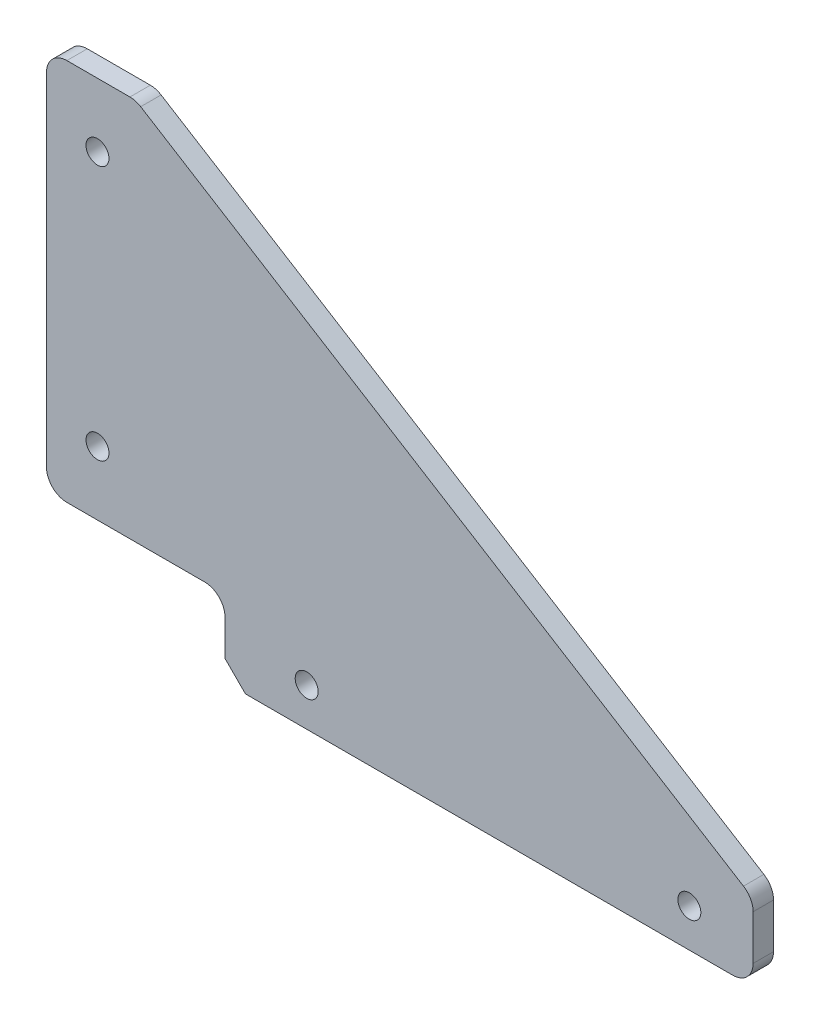
ISO-10303-21;
HEADER;
FILE_DESCRIPTION(('STEP AP214'),'2;1');
FILE_NAME('part.step','',(''),(''),'','','');
FILE_SCHEMA(('AUTOMOTIVE_DESIGN { 1 0 10303 214 1 1 1 1 }'));
ENDSEC;
DATA;
#1=APPLICATION_CONTEXT('core data for automotive mechanical design processes');
#2=APPLICATION_PROTOCOL_DEFINITION('international standard','automotive_design',2000,#1);
#3=PRODUCT_CONTEXT('',#1,'mechanical');
#4=PRODUCT('Part','Part','',(#3));
#5=PRODUCT_RELATED_PRODUCT_CATEGORY('part','',(#4));
#6=PRODUCT_DEFINITION_FORMATION('','',#4);
#7=PRODUCT_DEFINITION_CONTEXT('part definition',#1,'design');
#8=PRODUCT_DEFINITION('design','',#6,#7);
#9=PRODUCT_DEFINITION_SHAPE('','',#8);
#10=(LENGTH_UNIT() NAMED_UNIT(*) SI_UNIT(.MILLI.,.METRE.));
#11=(NAMED_UNIT(*) PLANE_ANGLE_UNIT() SI_UNIT($,.RADIAN.));
#12=(NAMED_UNIT(*) SI_UNIT($,.STERADIAN.) SOLID_ANGLE_UNIT());
#13=UNCERTAINTY_MEASURE_WITH_UNIT(LENGTH_MEASURE(1.E-05),#10,'distance_accuracy_value','');
#14=(GEOMETRIC_REPRESENTATION_CONTEXT(3) GLOBAL_UNCERTAINTY_ASSIGNED_CONTEXT((#13)) GLOBAL_UNIT_ASSIGNED_CONTEXT((#10,
#11,#12)) REPRESENTATION_CONTEXT('',''));
#15=CARTESIAN_POINT('',(0.,0.,0.));
#16=DIRECTION('',(0.,0.,1.));
#17=DIRECTION('',(1.,0.,0.));
#18=AXIS2_PLACEMENT_3D('',#15,#16,#17);
#19=CARTESIAN_POINT('',(-86.6689221257626,123.251708428246,8.));
#20=DIRECTION('',(0.,0.,-1.));
#21=DIRECTION('',(-1.,0.,0.));
#22=AXIS2_PLACEMENT_3D('',#19,#20,#21);
#23=PLANE('',#22);
#24=CARTESIAN_POINT('',(-86.6689221257626,123.251708428246,8.));
#25=DIRECTION('',(0.,0.,1.));
#26=DIRECTION('',(-1.,0.,0.));
#27=AXIS2_PLACEMENT_3D('',#24,#25,#26);
#28=CIRCLE('',#27,8.);
#29=CARTESIAN_POINT('',(-82.4542166522612,130.051433258828,8.));
#30=VERTEX_POINT('',#29);
#31=CARTESIAN_POINT('',(-86.6689221257626,131.251708428246,8.));
#32=VERTEX_POINT('',#31);
#33=EDGE_CURVE('E194',#30,#32,#28,.T.);
#34=ORIENTED_EDGE('',*,*,#33,.T.);
#35=DIRECTION('',(-1.,0.,0.));
#36=VECTOR('',#35,1.);
#37=CARTESIAN_POINT('',(-86.6689221257626,131.251708428246,8.));
#38=LINE('',#37,#36);
#39=CARTESIAN_POINT('',(-111.390660592255,131.251708428246,8.));
#40=VERTEX_POINT('',#39);
#41=EDGE_CURVE('E112',#32,#40,#38,.T.);
#42=ORIENTED_EDGE('',*,*,#41,.T.);
#43=CARTESIAN_POINT('',(-111.390660592255,123.251708428246,8.));
#44=DIRECTION('',(0.,0.,1.));
#45=DIRECTION('',(-1.,0.,0.));
#46=AXIS2_PLACEMENT_3D('',#43,#44,#45);
#47=CIRCLE('',#46,8.);
#48=CARTESIAN_POINT('',(-119.390660592255,123.251708428246,8.));
#49=VERTEX_POINT('',#48);
#50=EDGE_CURVE('E227',#40,#49,#47,.T.);
#51=ORIENTED_EDGE('',*,*,#50,.T.);
#52=DIRECTION('',(0.,-1.,0.));
#53=VECTOR('',#52,1.);
#54=CARTESIAN_POINT('',(-119.390660592255,123.251708428246,8.));
#55=LINE('',#54,#53);
#56=CARTESIAN_POINT('',(-119.390660592255,-10.748291571754,8.));
#57=VERTEX_POINT('',#56);
#58=EDGE_CURVE('E246',#49,#57,#55,.T.);
#59=ORIENTED_EDGE('',*,*,#58,.T.);
#60=CARTESIAN_POINT('',(-111.390660592255,-10.748291571754,8.));
#61=DIRECTION('',(0.,0.,1.));
#62=DIRECTION('',(-1.,0.,0.));
#63=AXIS2_PLACEMENT_3D('',#60,#61,#62);
#64=CIRCLE('',#63,8.00000000000001);
#65=CARTESIAN_POINT('',(-111.390660592255,-18.748291571754,8.));
#66=VERTEX_POINT('',#65);
#67=EDGE_CURVE('E243',#57,#66,#64,.T.);
#68=ORIENTED_EDGE('',*,*,#67,.T.);
#69=DIRECTION('',(1.,0.,0.));
#70=VECTOR('',#69,1.);
#71=CARTESIAN_POINT('',(-111.390660592255,-18.748291571754,8.));
#72=LINE('',#71,#70);
#73=CARTESIAN_POINT('',(-57.3906605922552,-18.748291571754,8.));
#74=VERTEX_POINT('',#73);
#75=EDGE_CURVE('E245',#66,#74,#72,.T.);
#76=ORIENTED_EDGE('',*,*,#75,.T.);
#77=CARTESIAN_POINT('',(-57.3906605922552,-26.748291571754,8.));
#78=DIRECTION('',(0.,0.,-1.));
#79=DIRECTION('',(1.,0.,0.));
#80=AXIS2_PLACEMENT_3D('',#77,#78,#79);
#81=CIRCLE('',#80,8.);
#82=CARTESIAN_POINT('',(-49.3906605922552,-26.748291571754,8.));
#83=VERTEX_POINT('',#82);
#84=EDGE_CURVE('E248',#74,#83,#81,.T.);
#85=ORIENTED_EDGE('',*,*,#84,.T.);
#86=DIRECTION('',(0.,-1.,0.));
#87=VECTOR('',#86,1.);
#88=CARTESIAN_POINT('',(-49.3906605922552,-26.748291571754,8.));
#89=LINE('',#88,#87);
#90=CARTESIAN_POINT('',(-49.3906605922552,-40.748291571754,8.));
#91=VERTEX_POINT('',#90);
#92=EDGE_CURVE('E254',#83,#91,#89,.T.);
#93=ORIENTED_EDGE('',*,*,#92,.T.);
#94=DIRECTION('',(0.70710678118655,-0.707106781186545,0.));
#95=VECTOR('',#94,1.);
#96=CARTESIAN_POINT('',(-41.3906605922551,-48.748291571754,8.));
#97=LINE('',#96,#95);
#98=CARTESIAN_POINT('',(-41.3906605922551,-48.748291571754,8.));
#99=VERTEX_POINT('',#98);
#100=EDGE_CURVE('E256',#91,#99,#97,.T.);
#101=ORIENTED_EDGE('',*,*,#100,.T.);
#102=DIRECTION('',(1.,0.,0.));
#103=VECTOR('',#102,1.);
#104=CARTESIAN_POINT('',(-41.3906605922551,-48.748291571754,8.));
#105=LINE('',#104,#103);
#106=CARTESIAN_POINT('',(149.609339407745,-48.748291571754,8.));
#107=VERTEX_POINT('',#106);
#108=EDGE_CURVE('E258',#99,#107,#105,.T.);
#109=ORIENTED_EDGE('',*,*,#108,.T.);
#110=CARTESIAN_POINT('',(149.609339407745,-40.748291571754,8.));
#111=DIRECTION('',(0.,0.,1.));
#112=DIRECTION('',(-1.,0.,0.));
#113=AXIS2_PLACEMENT_3D('',#110,#111,#112);
#114=CIRCLE('',#113,8.);
#115=CARTESIAN_POINT('',(157.609339407745,-40.7482915717539,8.));
#116=VERTEX_POINT('',#115);
#117=EDGE_CURVE('E149',#107,#116,#114,.T.);
#118=ORIENTED_EDGE('',*,*,#117,.T.);
#119=DIRECTION('',(0.,1.,0.));
#120=VECTOR('',#119,1.);
#121=CARTESIAN_POINT('',(157.609339407745,-40.7482915717539,8.));
#122=LINE('',#121,#120);
#123=CARTESIAN_POINT('',(157.609339407745,-23.2017594644239,8.));
#124=VERTEX_POINT('',#123);
#125=EDGE_CURVE('E143',#116,#124,#122,.T.);
#126=ORIENTED_EDGE('',*,*,#125,.T.);
#127=CARTESIAN_POINT('',(149.609339407745,-23.2017594644239,8.));
#128=DIRECTION('',(0.,0.,1.));
#129=DIRECTION('',(-1.,0.,0.));
#130=AXIS2_PLACEMENT_3D('',#127,#128,#129);
#131=CIRCLE('',#130,7.99999999999999);
#132=CARTESIAN_POINT('',(153.824044881246,-16.4020346338417,8.));
#133=VERTEX_POINT('',#132);
#134=EDGE_CURVE('E147',#124,#133,#131,.T.);
#135=ORIENTED_EDGE('',*,*,#134,.T.);
#136=DIRECTION('',(-0.849965603822785,0.526838184187677,0.));
#137=VECTOR('',#136,1.);
#138=CARTESIAN_POINT('',(153.824044881246,-16.4020346338417,8.));
#139=LINE('',#138,#137);
#140=EDGE_CURVE('E51',#133,#30,#139,.T.);
#141=ORIENTED_EDGE('',*,*,#140,.T.);
#142=EDGE_LOOP('',(#34,#42,#51,#59,#68,#76,#85,#93,#101,#109,#118,#126,#135,#141));
#143=FACE_BOUND('',#142,.T.);
#144=CARTESIAN_POINT('',(-99.3906605922552,106.251708428246,8.));
#145=DIRECTION('',(0.,0.,1.));
#146=DIRECTION('',(1.,0.,0.));
#147=AXIS2_PLACEMENT_3D('',#144,#145,#146);
#148=CIRCLE('',#147,4.50000000000001);
#149=CARTESIAN_POINT('',(-94.8906605922552,106.251708428246,8.));
#150=VERTEX_POINT('',#149);
#151=EDGE_CURVE('E171',#150,#150,#148,.T.);
#152=ORIENTED_EDGE('',*,*,#151,.F.);
#153=EDGE_LOOP('',(#152));
#154=FACE_BOUND('',#153,.T.);
#155=CARTESIAN_POINT('',(-99.3906605922552,6.25170842824602,8.));
#156=DIRECTION('',(0.,0.,1.));
#157=DIRECTION('',(1.,0.,0.));
#158=AXIS2_PLACEMENT_3D('',#155,#156,#157);
#159=CIRCLE('',#158,4.5);
#160=CARTESIAN_POINT('',(-94.8906605922551,6.25170842824602,8.));
#161=VERTEX_POINT('',#160);
#162=EDGE_CURVE('E322',#161,#161,#159,.T.);
#163=ORIENTED_EDGE('',*,*,#162,.F.);
#164=EDGE_LOOP('',(#163));
#165=FACE_BOUND('',#164,.T.);
#166=CARTESIAN_POINT('',(-17.3906605922552,-33.748291571754,8.));
#167=DIRECTION('',(0.,0.,1.));
#168=DIRECTION('',(1.,0.,0.));
#169=AXIS2_PLACEMENT_3D('',#166,#167,#168);
#170=CIRCLE('',#169,4.50000000000001);
#171=CARTESIAN_POINT('',(-12.8906605922552,-33.748291571754,8.));
#172=VERTEX_POINT('',#171);
#173=EDGE_CURVE('E316',#172,#172,#170,.T.);
#174=ORIENTED_EDGE('',*,*,#173,.F.);
#175=EDGE_LOOP('',(#174));
#176=FACE_BOUND('',#175,.T.);
#177=CARTESIAN_POINT('',(132.609339407745,-33.748291571754,8.));
#178=DIRECTION('',(0.,0.,1.));
#179=DIRECTION('',(1.,0.,0.));
#180=AXIS2_PLACEMENT_3D('',#177,#178,#179);
#181=CIRCLE('',#180,4.49999999999996);
#182=CARTESIAN_POINT('',(137.109339407745,-33.748291571754,8.));
#183=VERTEX_POINT('',#182);
#184=EDGE_CURVE('E307',#183,#183,#181,.T.);
#185=ORIENTED_EDGE('',*,*,#184,.F.);
#186=EDGE_LOOP('',(#185));
#187=FACE_BOUND('',#186,.T.);
#188=ADVANCED_FACE('F34',(#143,#154,#165,#176,#187),#23,.F.);
#189=CARTESIAN_POINT('',(-86.6689221257626,123.251708428246,0.));
#190=DIRECTION('',(0.,0.,-1.));
#191=DIRECTION('',(-1.,0.,0.));
#192=AXIS2_PLACEMENT_3D('',#189,#190,#191);
#193=PLANE('',#192);
#194=CARTESIAN_POINT('',(-17.3906605922552,-33.748291571754,0.));
#195=DIRECTION('',(0.,0.,1.));
#196=DIRECTION('',(1.,0.,0.));
#197=AXIS2_PLACEMENT_3D('',#194,#195,#196);
#198=CIRCLE('',#197,4.50000000000001);
#199=CARTESIAN_POINT('',(-12.8906605922552,-33.748291571754,0.));
#200=VERTEX_POINT('',#199);
#201=EDGE_CURVE('E313',#200,#200,#198,.T.);
#202=ORIENTED_EDGE('',*,*,#201,.T.);
#203=EDGE_LOOP('',(#202));
#204=FACE_BOUND('',#203,.T.);
#205=CARTESIAN_POINT('',(-99.3906605922552,106.251708428246,0.));
#206=DIRECTION('',(0.,0.,1.));
#207=DIRECTION('',(1.,0.,0.));
#208=AXIS2_PLACEMENT_3D('',#205,#206,#207);
#209=CIRCLE('',#208,4.50000000000001);
#210=CARTESIAN_POINT('',(-94.8906605922552,106.251708428246,0.));
#211=VERTEX_POINT('',#210);
#212=EDGE_CURVE('E325',#211,#211,#209,.T.);
#213=ORIENTED_EDGE('',*,*,#212,.T.);
#214=EDGE_LOOP('',(#213));
#215=FACE_BOUND('',#214,.T.);
#216=CARTESIAN_POINT('',(-86.6689221257626,123.251708428246,0.));
#217=DIRECTION('',(0.,0.,1.));
#218=DIRECTION('',(-1.,0.,0.));
#219=AXIS2_PLACEMENT_3D('',#216,#217,#218);
#220=CIRCLE('',#219,8.);
#221=CARTESIAN_POINT('',(-82.4542166522612,130.051433258828,0.));
#222=VERTEX_POINT('',#221);
#223=CARTESIAN_POINT('',(-86.6689221257626,131.251708428246,0.));
#224=VERTEX_POINT('',#223);
#225=EDGE_CURVE('E167',#222,#224,#220,.T.);
#226=ORIENTED_EDGE('',*,*,#225,.F.);
#227=DIRECTION('',(-0.849965603822785,0.526838184187677,0.));
#228=VECTOR('',#227,1.);
#229=CARTESIAN_POINT('',(153.824044881246,-16.4020346338417,0.));
#230=LINE('',#229,#228);
#231=CARTESIAN_POINT('',(153.824044881246,-16.4020346338417,0.));
#232=VERTEX_POINT('',#231);
#233=EDGE_CURVE('E104',#232,#222,#230,.T.);
#234=ORIENTED_EDGE('',*,*,#233,.F.);
#235=CARTESIAN_POINT('',(149.609339407745,-23.2017594644239,0.));
#236=DIRECTION('',(0.,0.,1.));
#237=DIRECTION('',(-1.,0.,0.));
#238=AXIS2_PLACEMENT_3D('',#235,#236,#237);
#239=CIRCLE('',#238,7.99999999999999);
#240=CARTESIAN_POINT('',(157.609339407745,-23.2017594644239,0.));
#241=VERTEX_POINT('',#240);
#242=EDGE_CURVE('E98',#241,#232,#239,.T.);
#243=ORIENTED_EDGE('',*,*,#242,.F.);
#244=DIRECTION('',(0.,1.,0.));
#245=VECTOR('',#244,1.);
#246=CARTESIAN_POINT('',(157.609339407745,-40.7482915717539,0.));
#247=LINE('',#246,#245);
#248=CARTESIAN_POINT('',(157.609339407745,-40.7482915717539,0.));
#249=VERTEX_POINT('',#248);
#250=EDGE_CURVE('E157',#249,#241,#247,.T.);
#251=ORIENTED_EDGE('',*,*,#250,.F.);
#252=CARTESIAN_POINT('',(149.609339407745,-40.748291571754,0.));
#253=DIRECTION('',(0.,0.,1.));
#254=DIRECTION('',(-1.,0.,0.));
#255=AXIS2_PLACEMENT_3D('',#252,#253,#254);
#256=CIRCLE('',#255,8.);
#257=CARTESIAN_POINT('',(149.609339407745,-48.748291571754,0.));
#258=VERTEX_POINT('',#257);
#259=EDGE_CURVE('E189',#258,#249,#256,.T.);
#260=ORIENTED_EDGE('',*,*,#259,.F.);
#261=DIRECTION('',(1.,0.,0.));
#262=VECTOR('',#261,1.);
#263=CARTESIAN_POINT('',(-41.3906605922551,-48.748291571754,0.));
#264=LINE('',#263,#262);
#265=CARTESIAN_POINT('',(-41.3906605922551,-48.748291571754,0.));
#266=VERTEX_POINT('',#265);
#267=EDGE_CURVE('E187',#266,#258,#264,.T.);
#268=ORIENTED_EDGE('',*,*,#267,.F.);
#269=DIRECTION('',(0.70710678118655,-0.707106781186545,0.));
#270=VECTOR('',#269,1.);
#271=CARTESIAN_POINT('',(-41.3906605922551,-48.748291571754,0.));
#272=LINE('',#271,#270);
#273=CARTESIAN_POINT('',(-49.3906605922552,-40.748291571754,0.));
#274=VERTEX_POINT('',#273);
#275=EDGE_CURVE('E185',#274,#266,#272,.T.);
#276=ORIENTED_EDGE('',*,*,#275,.F.);
#277=DIRECTION('',(0.,-1.,0.));
#278=VECTOR('',#277,1.);
#279=CARTESIAN_POINT('',(-49.3906605922552,-26.748291571754,0.));
#280=LINE('',#279,#278);
#281=CARTESIAN_POINT('',(-49.3906605922552,-26.748291571754,0.));
#282=VERTEX_POINT('',#281);
#283=EDGE_CURVE('E183',#282,#274,#280,.T.);
#284=ORIENTED_EDGE('',*,*,#283,.F.);
#285=CARTESIAN_POINT('',(-57.3906605922552,-26.748291571754,0.));
#286=DIRECTION('',(0.,0.,-1.));
#287=DIRECTION('',(1.,0.,0.));
#288=AXIS2_PLACEMENT_3D('',#285,#286,#287);
#289=CIRCLE('',#288,8.);
#290=CARTESIAN_POINT('',(-57.3906605922552,-18.748291571754,0.));
#291=VERTEX_POINT('',#290);
#292=EDGE_CURVE('E181',#291,#282,#289,.T.);
#293=ORIENTED_EDGE('',*,*,#292,.F.);
#294=DIRECTION('',(1.,0.,0.));
#295=VECTOR('',#294,1.);
#296=CARTESIAN_POINT('',(-111.390660592255,-18.748291571754,0.));
#297=LINE('',#296,#295);
#298=CARTESIAN_POINT('',(-111.390660592255,-18.748291571754,0.));
#299=VERTEX_POINT('',#298);
#300=EDGE_CURVE('E179',#299,#291,#297,.T.);
#301=ORIENTED_EDGE('',*,*,#300,.F.);
#302=CARTESIAN_POINT('',(-111.390660592255,-10.748291571754,0.));
#303=DIRECTION('',(0.,0.,1.));
#304=DIRECTION('',(-1.,0.,0.));
#305=AXIS2_PLACEMENT_3D('',#302,#303,#304);
#306=CIRCLE('',#305,8.00000000000001);
#307=CARTESIAN_POINT('',(-119.390660592255,-10.748291571754,0.));
#308=VERTEX_POINT('',#307);
#309=EDGE_CURVE('E177',#308,#299,#306,.T.);
#310=ORIENTED_EDGE('',*,*,#309,.F.);
#311=DIRECTION('',(0.,-1.,0.));
#312=VECTOR('',#311,1.);
#313=CARTESIAN_POINT('',(-119.390660592255,123.251708428246,0.));
#314=LINE('',#313,#312);
#315=CARTESIAN_POINT('',(-119.390660592255,123.251708428246,0.));
#316=VERTEX_POINT('',#315);
#317=EDGE_CURVE('E175',#316,#308,#314,.T.);
#318=ORIENTED_EDGE('',*,*,#317,.F.);
#319=CARTESIAN_POINT('',(-111.390660592255,123.251708428246,0.));
#320=DIRECTION('',(0.,0.,1.));
#321=DIRECTION('',(-1.,0.,0.));
#322=AXIS2_PLACEMENT_3D('',#319,#320,#321);
#323=CIRCLE('',#322,8.);
#324=CARTESIAN_POINT('',(-111.390660592255,131.251708428246,0.));
#325=VERTEX_POINT('',#324);
#326=EDGE_CURVE('E173',#325,#316,#323,.T.);
#327=ORIENTED_EDGE('',*,*,#326,.F.);
#328=DIRECTION('',(-1.,0.,0.));
#329=VECTOR('',#328,1.);
#330=CARTESIAN_POINT('',(-86.6689221257626,131.251708428246,0.));
#331=LINE('',#330,#329);
#332=EDGE_CURVE('E170',#224,#325,#331,.T.);
#333=ORIENTED_EDGE('',*,*,#332,.F.);
#334=EDGE_LOOP('',(#226,#234,#243,#251,#260,#268,#276,#284,#293,#301,#310,#318,#327,#333));
#335=FACE_BOUND('',#334,.T.);
#336=CARTESIAN_POINT('',(-99.3906605922552,6.25170842824602,0.));
#337=DIRECTION('',(0.,0.,1.));
#338=DIRECTION('',(1.,0.,0.));
#339=AXIS2_PLACEMENT_3D('',#336,#337,#338);
#340=CIRCLE('',#339,4.5);
#341=CARTESIAN_POINT('',(-94.8906605922551,6.25170842824602,0.));
#342=VERTEX_POINT('',#341);
#343=EDGE_CURVE('E319',#342,#342,#340,.T.);
#344=ORIENTED_EDGE('',*,*,#343,.T.);
#345=EDGE_LOOP('',(#344));
#346=FACE_BOUND('',#345,.T.);
#347=CARTESIAN_POINT('',(132.609339407745,-33.748291571754,0.));
#348=DIRECTION('',(0.,0.,1.));
#349=DIRECTION('',(1.,0.,0.));
#350=AXIS2_PLACEMENT_3D('',#347,#348,#349);
#351=CIRCLE('',#350,4.49999999999996);
#352=CARTESIAN_POINT('',(137.109339407745,-33.748291571754,0.));
#353=VERTEX_POINT('',#352);
#354=EDGE_CURVE('E310',#353,#353,#351,.T.);
#355=ORIENTED_EDGE('',*,*,#354,.T.);
#356=EDGE_LOOP('',(#355));
#357=FACE_BOUND('',#356,.T.);
#358=ADVANCED_FACE('F231',(#204,#215,#335,#346,#357),#193,.T.);
#359=CARTESIAN_POINT('',(-86.6689221257626,123.251708428246,8.));
#360=DIRECTION('',(0.,0.,-1.));
#361=DIRECTION('',(-1.,0.,0.));
#362=AXIS2_PLACEMENT_3D('',#359,#360,#361);
#363=CYLINDRICAL_SURFACE('',#362,8.);
#364=ORIENTED_EDGE('',*,*,#225,.T.);
#365=DIRECTION('',(0.,0.,-1.));
#366=VECTOR('',#365,1.);
#367=CARTESIAN_POINT('',(-86.6689221257626,131.251708428246,8.));
#368=LINE('',#367,#366);
#369=EDGE_CURVE('E11',#32,#224,#368,.T.);
#370=ORIENTED_EDGE('',*,*,#369,.F.);
#371=ORIENTED_EDGE('',*,*,#33,.F.);
#372=DIRECTION('',(0.,0.,-1.));
#373=VECTOR('',#372,1.);
#374=CARTESIAN_POINT('',(-82.4542166522612,130.051433258828,8.));
#375=LINE('',#374,#373);
#376=EDGE_CURVE('E163',#30,#222,#375,.T.);
#377=ORIENTED_EDGE('',*,*,#376,.T.);
#378=EDGE_LOOP('',(#364,#370,#371,#377));
#379=FACE_BOUND('',#378,.T.);
#380=ADVANCED_FACE('F36',(#379),#363,.T.);
#381=CARTESIAN_POINT('',(-86.6689221257626,131.251708428246,8.));
#382=DIRECTION('',(0.,-1.,0.));
#383=DIRECTION('',(1.,0.,0.));
#384=AXIS2_PLACEMENT_3D('',#381,#382,#383);
#385=PLANE('',#384);
#386=ORIENTED_EDGE('',*,*,#332,.T.);
#387=DIRECTION('',(0.,0.,-1.));
#388=VECTOR('',#387,1.);
#389=CARTESIAN_POINT('',(-111.390660592255,131.251708428246,8.));
#390=LINE('',#389,#388);
#391=EDGE_CURVE('E43',#40,#325,#390,.T.);
#392=ORIENTED_EDGE('',*,*,#391,.F.);
#393=ORIENTED_EDGE('',*,*,#41,.F.);
#394=ORIENTED_EDGE('',*,*,#369,.T.);
#395=EDGE_LOOP('',(#386,#392,#393,#394));
#396=FACE_BOUND('',#395,.T.);
#397=ADVANCED_FACE('F457',(#396),#385,.F.);
#398=CARTESIAN_POINT('',(-111.390660592255,123.251708428246,8.));
#399=DIRECTION('',(0.,0.,-1.));
#400=DIRECTION('',(-1.,0.,0.));
#401=AXIS2_PLACEMENT_3D('',#398,#399,#400);
#402=CYLINDRICAL_SURFACE('',#401,8.);
#403=ORIENTED_EDGE('',*,*,#326,.T.);
#404=DIRECTION('',(0.,0.,-1.));
#405=VECTOR('',#404,1.);
#406=CARTESIAN_POINT('',(-119.390660592255,123.251708428246,8.));
#407=LINE('',#406,#405);
#408=EDGE_CURVE('E219',#49,#316,#407,.T.);
#409=ORIENTED_EDGE('',*,*,#408,.F.);
#410=ORIENTED_EDGE('',*,*,#50,.F.);
#411=ORIENTED_EDGE('',*,*,#391,.T.);
#412=EDGE_LOOP('',(#403,#409,#410,#411));
#413=FACE_BOUND('',#412,.T.);
#414=ADVANCED_FACE('F225',(#413),#402,.T.);
#415=CARTESIAN_POINT('',(-119.390660592255,123.251708428246,8.));
#416=DIRECTION('',(1.,0.,0.));
#417=DIRECTION('',(0.,1.,0.));
#418=AXIS2_PLACEMENT_3D('',#415,#416,#417);
#419=PLANE('',#418);
#420=ORIENTED_EDGE('',*,*,#317,.T.);
#421=DIRECTION('',(0.,0.,-1.));
#422=VECTOR('',#421,1.);
#423=CARTESIAN_POINT('',(-119.390660592255,-10.748291571754,8.));
#424=LINE('',#423,#422);
#425=EDGE_CURVE('E216',#57,#308,#424,.T.);
#426=ORIENTED_EDGE('',*,*,#425,.F.);
#427=ORIENTED_EDGE('',*,*,#58,.F.);
#428=ORIENTED_EDGE('',*,*,#408,.T.);
#429=EDGE_LOOP('',(#420,#426,#427,#428));
#430=FACE_BOUND('',#429,.T.);
#431=ADVANCED_FACE('F237',(#430),#419,.F.);
#432=CARTESIAN_POINT('',(-111.390660592255,-10.748291571754,8.));
#433=DIRECTION('',(0.,0.,-1.));
#434=DIRECTION('',(-1.,0.,0.));
#435=AXIS2_PLACEMENT_3D('',#432,#433,#434);
#436=CYLINDRICAL_SURFACE('',#435,8.00000000000001);
#437=ORIENTED_EDGE('',*,*,#309,.T.);
#438=DIRECTION('',(0.,0.,-1.));
#439=VECTOR('',#438,1.);
#440=CARTESIAN_POINT('',(-111.390660592255,-18.748291571754,8.));
#441=LINE('',#440,#439);
#442=EDGE_CURVE('E213',#66,#299,#441,.T.);
#443=ORIENTED_EDGE('',*,*,#442,.F.);
#444=ORIENTED_EDGE('',*,*,#67,.F.);
#445=ORIENTED_EDGE('',*,*,#425,.T.);
#446=EDGE_LOOP('',(#437,#443,#444,#445));
#447=FACE_BOUND('',#446,.T.);
#448=ADVANCED_FACE('F241',(#447),#436,.T.);
#449=CARTESIAN_POINT('',(-111.390660592255,-18.748291571754,8.));
#450=DIRECTION('',(0.,1.,0.));
#451=DIRECTION('',(0.,0.,1.));
#452=AXIS2_PLACEMENT_3D('',#449,#450,#451);
#453=PLANE('',#452);
#454=ORIENTED_EDGE('',*,*,#300,.T.);
#455=DIRECTION('',(0.,0.,-1.));
#456=VECTOR('',#455,1.);
#457=CARTESIAN_POINT('',(-57.3906605922552,-18.748291571754,8.));
#458=LINE('',#457,#456);
#459=EDGE_CURVE('E210',#74,#291,#458,.T.);
#460=ORIENTED_EDGE('',*,*,#459,.F.);
#461=ORIENTED_EDGE('',*,*,#75,.F.);
#462=ORIENTED_EDGE('',*,*,#442,.T.);
#463=EDGE_LOOP('',(#454,#460,#461,#462));
#464=FACE_BOUND('',#463,.T.);
#465=ADVANCED_FACE('F422',(#464),#453,.F.);
#466=CARTESIAN_POINT('',(-57.3906605922552,-26.748291571754,8.));
#467=DIRECTION('',(0.,0.,-1.));
#468=DIRECTION('',(-1.,0.,0.));
#469=AXIS2_PLACEMENT_3D('',#466,#467,#468);
#470=CYLINDRICAL_SURFACE('',#469,8.);
#471=ORIENTED_EDGE('',*,*,#292,.T.);
#472=DIRECTION('',(0.,0.,-1.));
#473=VECTOR('',#472,1.);
#474=CARTESIAN_POINT('',(-49.3906605922552,-26.748291571754,8.));
#475=LINE('',#474,#473);
#476=EDGE_CURVE('E207',#83,#282,#475,.T.);
#477=ORIENTED_EDGE('',*,*,#476,.F.);
#478=ORIENTED_EDGE('',*,*,#84,.F.);
#479=ORIENTED_EDGE('',*,*,#459,.T.);
#480=EDGE_LOOP('',(#471,#477,#478,#479));
#481=FACE_BOUND('',#480,.T.);
#482=ADVANCED_FACE('F412',(#481),#470,.F.);
#483=CARTESIAN_POINT('',(-49.3906605922552,-26.748291571754,8.));
#484=DIRECTION('',(1.,0.,0.));
#485=DIRECTION('',(0.,0.,-1.));
#486=AXIS2_PLACEMENT_3D('',#483,#484,#485);
#487=PLANE('',#486);
#488=ORIENTED_EDGE('',*,*,#283,.T.);
#489=DIRECTION('',(0.,0.,-1.));
#490=VECTOR('',#489,1.);
#491=CARTESIAN_POINT('',(-49.3906605922552,-40.748291571754,8.));
#492=LINE('',#491,#490);
#493=EDGE_CURVE('E204',#91,#274,#492,.T.);
#494=ORIENTED_EDGE('',*,*,#493,.F.);
#495=ORIENTED_EDGE('',*,*,#92,.F.);
#496=ORIENTED_EDGE('',*,*,#476,.T.);
#497=EDGE_LOOP('',(#488,#494,#495,#496));
#498=FACE_BOUND('',#497,.T.);
#499=ADVANCED_FACE('F402',(#498),#487,.F.);
#500=CARTESIAN_POINT('',(-41.3906605922551,-48.748291571754,8.));
#501=DIRECTION('',(0.707106781186545,0.70710678118655,0.));
#502=DIRECTION('',(-0.70710678118655,0.707106781186545,0.));
#503=AXIS2_PLACEMENT_3D('',#500,#501,#502);
#504=PLANE('',#503);
#505=ORIENTED_EDGE('',*,*,#275,.T.);
#506=DIRECTION('',(0.,0.,-1.));
#507=VECTOR('',#506,1.);
#508=CARTESIAN_POINT('',(-41.3906605922551,-48.748291571754,8.));
#509=LINE('',#508,#507);
#510=EDGE_CURVE('E201',#99,#266,#509,.T.);
#511=ORIENTED_EDGE('',*,*,#510,.F.);
#512=ORIENTED_EDGE('',*,*,#100,.F.);
#513=ORIENTED_EDGE('',*,*,#493,.T.);
#514=EDGE_LOOP('',(#505,#511,#512,#513));
#515=FACE_BOUND('',#514,.T.);
#516=ADVANCED_FACE('F393',(#515),#504,.F.);
#517=CARTESIAN_POINT('',(-41.3906605922551,-48.748291571754,8.));
#518=DIRECTION('',(0.,1.,0.));
#519=DIRECTION('',(0.,0.,1.));
#520=AXIS2_PLACEMENT_3D('',#517,#518,#519);
#521=PLANE('',#520);
#522=ORIENTED_EDGE('',*,*,#267,.T.);
#523=DIRECTION('',(0.,0.,-1.));
#524=VECTOR('',#523,1.);
#525=CARTESIAN_POINT('',(149.609339407745,-48.748291571754,8.));
#526=LINE('',#525,#524);
#527=EDGE_CURVE('E198',#107,#258,#526,.T.);
#528=ORIENTED_EDGE('',*,*,#527,.F.);
#529=ORIENTED_EDGE('',*,*,#108,.F.);
#530=ORIENTED_EDGE('',*,*,#510,.T.);
#531=EDGE_LOOP('',(#522,#528,#529,#530));
#532=FACE_BOUND('',#531,.T.);
#533=ADVANCED_FACE('F264',(#532),#521,.F.);
#534=CARTESIAN_POINT('',(149.609339407745,-40.748291571754,8.));
#535=DIRECTION('',(0.,0.,-1.));
#536=DIRECTION('',(-1.,0.,0.));
#537=AXIS2_PLACEMENT_3D('',#534,#535,#536);
#538=CYLINDRICAL_SURFACE('',#537,8.);
#539=ORIENTED_EDGE('',*,*,#259,.T.);
#540=DIRECTION('',(0.,0.,-1.));
#541=VECTOR('',#540,1.);
#542=CARTESIAN_POINT('',(157.609339407745,-40.7482915717539,8.));
#543=LINE('',#542,#541);
#544=EDGE_CURVE('E158',#116,#249,#543,.T.);
#545=ORIENTED_EDGE('',*,*,#544,.F.);
#546=ORIENTED_EDGE('',*,*,#117,.F.);
#547=ORIENTED_EDGE('',*,*,#527,.T.);
#548=EDGE_LOOP('',(#539,#545,#546,#547));
#549=FACE_BOUND('',#548,.T.);
#550=ADVANCED_FACE('F268',(#549),#538,.T.);
#551=CARTESIAN_POINT('',(157.609339407745,-40.7482915717539,8.));
#552=DIRECTION('',(-1.,0.,0.));
#553=DIRECTION('',(0.,-1.,0.));
#554=AXIS2_PLACEMENT_3D('',#551,#552,#553);
#555=PLANE('',#554);
#556=ORIENTED_EDGE('',*,*,#250,.T.);
#557=DIRECTION('',(0.,0.,-1.));
#558=VECTOR('',#557,1.);
#559=CARTESIAN_POINT('',(157.609339407745,-23.2017594644239,8.));
#560=LINE('',#559,#558);
#561=EDGE_CURVE('E154',#124,#241,#560,.T.);
#562=ORIENTED_EDGE('',*,*,#561,.F.);
#563=ORIENTED_EDGE('',*,*,#125,.F.);
#564=ORIENTED_EDGE('',*,*,#544,.T.);
#565=EDGE_LOOP('',(#556,#562,#563,#564));
#566=FACE_BOUND('',#565,.T.);
#567=ADVANCED_FACE('F155',(#566),#555,.F.);
#568=CARTESIAN_POINT('',(149.609339407745,-23.2017594644239,8.));
#569=DIRECTION('',(0.,0.,-1.));
#570=DIRECTION('',(-1.,0.,0.));
#571=AXIS2_PLACEMENT_3D('',#568,#569,#570);
#572=CYLINDRICAL_SURFACE('',#571,7.99999999999999);
#573=ORIENTED_EDGE('',*,*,#242,.T.);
#574=DIRECTION('',(0.,0.,-1.));
#575=VECTOR('',#574,1.);
#576=CARTESIAN_POINT('',(153.824044881246,-16.4020346338417,8.));
#577=LINE('',#576,#575);
#578=EDGE_CURVE('E159',#133,#232,#577,.T.);
#579=ORIENTED_EDGE('',*,*,#578,.F.);
#580=ORIENTED_EDGE('',*,*,#134,.F.);
#581=ORIENTED_EDGE('',*,*,#561,.T.);
#582=EDGE_LOOP('',(#573,#579,#580,#581));
#583=FACE_BOUND('',#582,.T.);
#584=ADVANCED_FACE('F161',(#583),#572,.T.);
#585=CARTESIAN_POINT('',(153.824044881246,-16.4020346338417,8.));
#586=DIRECTION('',(-0.526838184187677,-0.849965603822785,0.));
#587=DIRECTION('',(0.849965603822785,-0.526838184187677,0.));
#588=AXIS2_PLACEMENT_3D('',#585,#586,#587);
#589=PLANE('',#588);
#590=ORIENTED_EDGE('',*,*,#233,.T.);
#591=ORIENTED_EDGE('',*,*,#376,.F.);
#592=ORIENTED_EDGE('',*,*,#140,.F.);
#593=ORIENTED_EDGE('',*,*,#578,.T.);
#594=EDGE_LOOP('',(#590,#591,#592,#593));
#595=FACE_BOUND('',#594,.T.);
#596=ADVANCED_FACE('F272',(#595),#589,.F.);
#597=CARTESIAN_POINT('',(-99.3906605922552,106.251708428246,8.));
#598=DIRECTION('',(0.,0.,-1.));
#599=DIRECTION('',(-1.,0.,0.));
#600=AXIS2_PLACEMENT_3D('',#597,#598,#599);
#601=CYLINDRICAL_SURFACE('',#600,4.50000000000001);
#602=ORIENTED_EDGE('',*,*,#151,.T.);
#603=EDGE_LOOP('',(#602));
#604=FACE_BOUND('',#603,.T.);
#605=ORIENTED_EDGE('',*,*,#212,.F.);
#606=EDGE_LOOP('',(#605));
#607=FACE_BOUND('',#606,.T.);
#608=ADVANCED_FACE('F274',(#604,#607),#601,.F.);
#609=CARTESIAN_POINT('',(-99.3906605922552,6.25170842824602,8.));
#610=DIRECTION('',(0.,0.,-1.));
#611=DIRECTION('',(-1.,0.,0.));
#612=AXIS2_PLACEMENT_3D('',#609,#610,#611);
#613=CYLINDRICAL_SURFACE('',#612,4.5);
#614=ORIENTED_EDGE('',*,*,#162,.T.);
#615=EDGE_LOOP('',(#614));
#616=FACE_BOUND('',#615,.T.);
#617=ORIENTED_EDGE('',*,*,#343,.F.);
#618=EDGE_LOOP('',(#617));
#619=FACE_BOUND('',#618,.T.);
#620=ADVANCED_FACE('F280',(#616,#619),#613,.F.);
#621=CARTESIAN_POINT('',(-17.3906605922552,-33.748291571754,8.));
#622=DIRECTION('',(0.,0.,-1.));
#623=DIRECTION('',(-1.,0.,0.));
#624=AXIS2_PLACEMENT_3D('',#621,#622,#623);
#625=CYLINDRICAL_SURFACE('',#624,4.50000000000001);
#626=ORIENTED_EDGE('',*,*,#173,.T.);
#627=EDGE_LOOP('',(#626));
#628=FACE_BOUND('',#627,.T.);
#629=ORIENTED_EDGE('',*,*,#201,.F.);
#630=EDGE_LOOP('',(#629));
#631=FACE_BOUND('',#630,.T.);
#632=ADVANCED_FACE('F294',(#628,#631),#625,.F.);
#633=CARTESIAN_POINT('',(132.609339407745,-33.748291571754,8.));
#634=DIRECTION('',(0.,0.,-1.));
#635=DIRECTION('',(-1.,0.,0.));
#636=AXIS2_PLACEMENT_3D('',#633,#634,#635);
#637=CYLINDRICAL_SURFACE('',#636,4.49999999999996);
#638=ORIENTED_EDGE('',*,*,#184,.T.);
#639=EDGE_LOOP('',(#638));
#640=FACE_BOUND('',#639,.T.);
#641=ORIENTED_EDGE('',*,*,#354,.F.);
#642=EDGE_LOOP('',(#641));
#643=FACE_BOUND('',#642,.T.);
#644=ADVANCED_FACE('F298',(#640,#643),#637,.F.);
#645=CLOSED_SHELL('',(#188,#358,#380,#397,#414,#431,#448,#465,#482,#499,#516,#533,#550,#567,
#584,#596,#608,#620,#632,#644));
#646=MANIFOLD_SOLID_BREP('B2',#645);
#647=ADVANCED_BREP_SHAPE_REPRESENTATION('',(#18,#646),#14);
#648=SHAPE_DEFINITION_REPRESENTATION(#9,#647);
ENDSEC;
END-ISO-10303-21;
